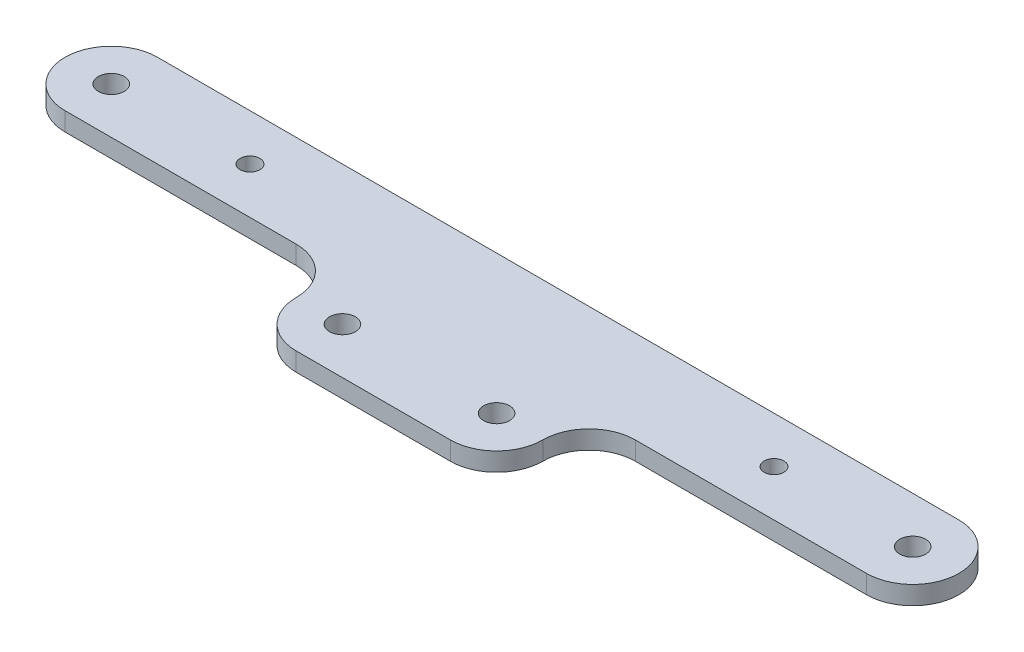
ISO-10303-21;
HEADER;
FILE_DESCRIPTION(('STEP AP214'),'2;1');
FILE_NAME('part.step','',(''),(''),'','','');
FILE_SCHEMA(('AUTOMOTIVE_DESIGN { 1 0 10303 214 1 1 1 1 }'));
ENDSEC;
DATA;
#1=APPLICATION_CONTEXT('core data for automotive mechanical design processes');
#2=APPLICATION_PROTOCOL_DEFINITION('international standard','automotive_design',2000,#1);
#3=PRODUCT_CONTEXT('',#1,'mechanical');
#4=PRODUCT('Part','Part','',(#3));
#5=PRODUCT_RELATED_PRODUCT_CATEGORY('part','',(#4));
#6=PRODUCT_DEFINITION_FORMATION('','',#4);
#7=PRODUCT_DEFINITION_CONTEXT('part definition',#1,'design');
#8=PRODUCT_DEFINITION('design','',#6,#7);
#9=PRODUCT_DEFINITION_SHAPE('','',#8);
#10=(LENGTH_UNIT() NAMED_UNIT(*) SI_UNIT(.MILLI.,.METRE.));
#11=(NAMED_UNIT(*) PLANE_ANGLE_UNIT() SI_UNIT($,.RADIAN.));
#12=(NAMED_UNIT(*) SI_UNIT($,.STERADIAN.) SOLID_ANGLE_UNIT());
#13=UNCERTAINTY_MEASURE_WITH_UNIT(LENGTH_MEASURE(1.E-05),#10,'distance_accuracy_value','');
#14=(GEOMETRIC_REPRESENTATION_CONTEXT(3) GLOBAL_UNCERTAINTY_ASSIGNED_CONTEXT((#13)) GLOBAL_UNIT_ASSIGNED_CONTEXT((#10,
#11,#12)) REPRESENTATION_CONTEXT('',''));
#15=CARTESIAN_POINT('',(0.,0.,0.));
#16=DIRECTION('',(0.,0.,1.));
#17=DIRECTION('',(1.,0.,0.));
#18=AXIS2_PLACEMENT_3D('',#15,#16,#17);
#19=CARTESIAN_POINT('',(-65.,3.,7.5));
#20=DIRECTION('',(0.,0.,-1.));
#21=DIRECTION('',(-1.,0.,0.));
#22=AXIS2_PLACEMENT_3D('',#19,#20,#21);
#23=PLANE('',#22);
#24=DIRECTION('',(1.,0.,0.));
#25=VECTOR('',#24,1.);
#26=CARTESIAN_POINT('',(-65.,0.,7.5));
#27=LINE('',#26,#25);
#28=CARTESIAN_POINT('',(-65.,0.,7.5));
#29=VERTEX_POINT('',#28);
#30=CARTESIAN_POINT('',(-27.5,0.,7.49999999999999));
#31=VERTEX_POINT('',#30);
#32=EDGE_CURVE('E234',#29,#31,#27,.T.);
#33=ORIENTED_EDGE('',*,*,#32,.T.);
#34=DIRECTION('',(0.,-1.,0.));
#35=VECTOR('',#34,1.);
#36=CARTESIAN_POINT('',(-27.5,3.,7.49999999999999));
#37=LINE('',#36,#35);
#38=CARTESIAN_POINT('',(-27.5,3.,7.49999999999999));
#39=VERTEX_POINT('',#38);
#40=EDGE_CURVE('E129',#31,#39,#37,.F.);
#41=ORIENTED_EDGE('',*,*,#40,.T.);
#42=DIRECTION('',(1.,0.,0.));
#43=VECTOR('',#42,1.);
#44=CARTESIAN_POINT('',(-65.,3.,7.5));
#45=LINE('',#44,#43);
#46=CARTESIAN_POINT('',(-65.,3.,7.5));
#47=VERTEX_POINT('',#46);
#48=EDGE_CURVE('E123',#47,#39,#45,.T.);
#49=ORIENTED_EDGE('',*,*,#48,.F.);
#50=DIRECTION('',(0.,-1.,0.));
#51=VECTOR('',#50,1.);
#52=CARTESIAN_POINT('',(-65.,3.,7.5));
#53=LINE('',#52,#51);
#54=EDGE_CURVE('E126',#47,#29,#53,.T.);
#55=ORIENTED_EDGE('',*,*,#54,.T.);
#56=EDGE_LOOP('',(#33,#41,#49,#55));
#57=FACE_BOUND('',#56,.T.);
#58=ADVANCED_FACE('F48',(#57),#23,.F.);
#59=CARTESIAN_POINT('',(27.5,3.,7.49999999999998));
#60=VERTEX_POINT('',#59);
#61=CARTESIAN_POINT('',(65.,3.,7.5));
#62=VERTEX_POINT('',#61);
#63=EDGE_CURVE('E133',#60,#62,#45,.T.);
#64=ORIENTED_EDGE('',*,*,#63,.F.);
#65=DIRECTION('',(0.,1.,0.));
#66=VECTOR('',#65,1.);
#67=CARTESIAN_POINT('',(27.5,0.,7.49999999999998));
#68=LINE('',#67,#66);
#69=CARTESIAN_POINT('',(27.5,0.,7.49999999999998));
#70=VERTEX_POINT('',#69);
#71=EDGE_CURVE('E150',#60,#70,#68,.F.);
#72=ORIENTED_EDGE('',*,*,#71,.T.);
#73=CARTESIAN_POINT('',(65.,0.,7.5));
#74=VERTEX_POINT('',#73);
#75=EDGE_CURVE('E233',#70,#74,#27,.T.);
#76=ORIENTED_EDGE('',*,*,#75,.T.);
#77=DIRECTION('',(0.,-1.,0.));
#78=VECTOR('',#77,1.);
#79=CARTESIAN_POINT('',(65.,3.,7.5));
#80=LINE('',#79,#78);
#81=EDGE_CURVE('E151',#62,#74,#80,.T.);
#82=ORIENTED_EDGE('',*,*,#81,.F.);
#83=EDGE_LOOP('',(#64,#72,#76,#82));
#84=FACE_BOUND('',#83,.T.);
#85=ADVANCED_FACE('F254',(#84),#23,.F.);
#86=CARTESIAN_POINT('',(-65.,3.,0.));
#87=DIRECTION('',(0.,1.,0.));
#88=DIRECTION('',(0.,0.,1.));
#89=AXIS2_PLACEMENT_3D('',#86,#87,#88);
#90=PLANE('',#89);
#91=CARTESIAN_POINT('',(-12.5,3.,15.));
#92=DIRECTION('',(0.,-1.,0.));
#93=DIRECTION('',(0.,0.,-1.));
#94=AXIS2_PLACEMENT_3D('',#91,#92,#93);
#95=CIRCLE('',#94,2.1);
#96=CARTESIAN_POINT('',(-12.5,3.,12.9));
#97=VERTEX_POINT('',#96);
#98=EDGE_CURVE('E206',#97,#97,#95,.T.);
#99=ORIENTED_EDGE('',*,*,#98,.T.);
#100=EDGE_LOOP('',(#99));
#101=FACE_BOUND('',#100,.T.);
#102=CARTESIAN_POINT('',(12.5,3.,15.));
#103=DIRECTION('',(0.,-1.,0.));
#104=DIRECTION('',(0.,0.,-1.));
#105=AXIS2_PLACEMENT_3D('',#102,#103,#104);
#106=CIRCLE('',#105,2.1);
#107=CARTESIAN_POINT('',(12.5,3.,12.9));
#108=VERTEX_POINT('',#107);
#109=EDGE_CURVE('E184',#108,#108,#106,.T.);
#110=ORIENTED_EDGE('',*,*,#109,.T.);
#111=EDGE_LOOP('',(#110));
#112=FACE_BOUND('',#111,.T.);
#113=CARTESIAN_POINT('',(65.,3.,0.));
#114=DIRECTION('',(0.,1.,0.));
#115=DIRECTION('',(0.,0.,1.));
#116=AXIS2_PLACEMENT_3D('',#113,#114,#115);
#117=CIRCLE('',#116,2.1);
#118=CARTESIAN_POINT('',(65.,3.,2.1));
#119=VERTEX_POINT('',#118);
#120=EDGE_CURVE('E212',#119,#119,#117,.T.);
#121=ORIENTED_EDGE('',*,*,#120,.F.);
#122=EDGE_LOOP('',(#121));
#123=FACE_BOUND('',#122,.T.);
#124=CARTESIAN_POINT('',(-42.5,3.,0.));
#125=DIRECTION('',(0.,1.,0.));
#126=DIRECTION('',(0.,0.,1.));
#127=AXIS2_PLACEMENT_3D('',#124,#125,#126);
#128=CIRCLE('',#127,1.6);
#129=CARTESIAN_POINT('',(-42.5,3.,1.6));
#130=VERTEX_POINT('',#129);
#131=EDGE_CURVE('E224',#130,#130,#128,.T.);
#132=ORIENTED_EDGE('',*,*,#131,.F.);
#133=EDGE_LOOP('',(#132));
#134=FACE_BOUND('',#133,.T.);
#135=DIRECTION('',(-1.,0.,0.));
#136=VECTOR('',#135,1.);
#137=CARTESIAN_POINT('',(-20.,3.,22.5));
#138=LINE('',#137,#136);
#139=CARTESIAN_POINT('',(12.5,3.,22.5));
#140=VERTEX_POINT('',#139);
#141=CARTESIAN_POINT('',(-12.5,3.,22.5));
#142=VERTEX_POINT('',#141);
#143=EDGE_CURVE('E194',#140,#142,#138,.T.);
#144=ORIENTED_EDGE('',*,*,#143,.F.);
#145=CARTESIAN_POINT('',(12.5,3.,15.));
#146=DIRECTION('',(0.,1.,0.));
#147=DIRECTION('',(0.,0.,1.));
#148=AXIS2_PLACEMENT_3D('',#145,#146,#147);
#149=CIRCLE('',#148,7.5);
#150=CARTESIAN_POINT('',(20.,3.,15.));
#151=VERTEX_POINT('',#150);
#152=EDGE_CURVE('E167',#140,#151,#149,.T.);
#153=ORIENTED_EDGE('',*,*,#152,.T.);
#154=CARTESIAN_POINT('',(27.5,3.,15.));
#155=DIRECTION('',(0.,1.,0.));
#156=DIRECTION('',(0.,0.,1.));
#157=AXIS2_PLACEMENT_3D('',#154,#155,#156);
#158=CIRCLE('',#157,7.5);
#159=EDGE_CURVE('E173',#151,#60,#158,.F.);
#160=ORIENTED_EDGE('',*,*,#159,.T.);
#161=ORIENTED_EDGE('',*,*,#63,.T.);
#162=CARTESIAN_POINT('',(65.,3.,0.));
#163=DIRECTION('',(0.,1.,0.));
#164=DIRECTION('',(0.,0.,1.));
#165=AXIS2_PLACEMENT_3D('',#162,#163,#164);
#166=CIRCLE('',#165,7.5);
#167=CARTESIAN_POINT('',(65.,3.,-7.50000000000002));
#168=VERTEX_POINT('',#167);
#169=EDGE_CURVE('E132',#62,#168,#166,.T.);
#170=ORIENTED_EDGE('',*,*,#169,.T.);
#171=DIRECTION('',(-1.,0.,0.));
#172=VECTOR('',#171,1.);
#173=CARTESIAN_POINT('',(-65.,3.,-7.5));
#174=LINE('',#173,#172);
#175=CARTESIAN_POINT('',(-65.,3.,-7.5));
#176=VERTEX_POINT('',#175);
#177=EDGE_CURVE('E141',#168,#176,#174,.T.);
#178=ORIENTED_EDGE('',*,*,#177,.T.);
#179=CARTESIAN_POINT('',(-65.,3.,0.));
#180=DIRECTION('',(0.,1.,0.));
#181=DIRECTION('',(0.,0.,1.));
#182=AXIS2_PLACEMENT_3D('',#179,#180,#181);
#183=CIRCLE('',#182,7.5);
#184=EDGE_CURVE('E136',#176,#47,#183,.T.);
#185=ORIENTED_EDGE('',*,*,#184,.T.);
#186=ORIENTED_EDGE('',*,*,#48,.T.);
#187=CARTESIAN_POINT('',(-27.5,3.,15.));
#188=DIRECTION('',(0.,1.,0.));
#189=DIRECTION('',(0.,0.,1.));
#190=AXIS2_PLACEMENT_3D('',#187,#188,#189);
#191=CIRCLE('',#190,7.5);
#192=CARTESIAN_POINT('',(-20.,3.,15.));
#193=VERTEX_POINT('',#192);
#194=EDGE_CURVE('E13',#39,#193,#191,.F.);
#195=ORIENTED_EDGE('',*,*,#194,.T.);
#196=CARTESIAN_POINT('',(-12.5,3.,15.));
#197=DIRECTION('',(0.,1.,0.));
#198=DIRECTION('',(0.,0.,1.));
#199=AXIS2_PLACEMENT_3D('',#196,#197,#198);
#200=CIRCLE('',#199,7.5);
#201=EDGE_CURVE('E165',#193,#142,#200,.T.);
#202=ORIENTED_EDGE('',*,*,#201,.T.);
#203=EDGE_LOOP('',(#144,#153,#160,#161,#170,#178,#185,#186,#195,#202));
#204=FACE_BOUND('',#203,.T.);
#205=CARTESIAN_POINT('',(-65.,3.,0.));
#206=DIRECTION('',(0.,1.,0.));
#207=DIRECTION('',(0.,0.,1.));
#208=AXIS2_PLACEMENT_3D('',#205,#206,#207);
#209=CIRCLE('',#208,2.1);
#210=CARTESIAN_POINT('',(-65.,3.,2.1));
#211=VERTEX_POINT('',#210);
#212=EDGE_CURVE('E218',#211,#211,#209,.T.);
#213=ORIENTED_EDGE('',*,*,#212,.F.);
#214=EDGE_LOOP('',(#213));
#215=FACE_BOUND('',#214,.T.);
#216=CARTESIAN_POINT('',(42.5,3.,0.));
#217=DIRECTION('',(0.,1.,0.));
#218=DIRECTION('',(0.,0.,1.));
#219=AXIS2_PLACEMENT_3D('',#216,#217,#218);
#220=CIRCLE('',#219,1.6);
#221=CARTESIAN_POINT('',(42.5,3.,1.59999999999998));
#222=VERTEX_POINT('',#221);
#223=EDGE_CURVE('E204',#222,#222,#220,.T.);
#224=ORIENTED_EDGE('',*,*,#223,.F.);
#225=EDGE_LOOP('',(#224));
#226=FACE_BOUND('',#225,.T.);
#227=ADVANCED_FACE('F138',(#101,#112,#123,#134,#204,#215,#226),#90,.T.);
#228=CARTESIAN_POINT('',(-65.,0.,0.));
#229=DIRECTION('',(0.,1.,0.));
#230=DIRECTION('',(0.,0.,1.));
#231=AXIS2_PLACEMENT_3D('',#228,#229,#230);
#232=PLANE('',#231);
#233=CARTESIAN_POINT('',(-12.5,0.,15.));
#234=DIRECTION('',(0.,-1.,0.));
#235=DIRECTION('',(0.,0.,-1.));
#236=AXIS2_PLACEMENT_3D('',#233,#234,#235);
#237=CIRCLE('',#236,2.1);
#238=CARTESIAN_POINT('',(-12.5,0.,12.9));
#239=VERTEX_POINT('',#238);
#240=EDGE_CURVE('E327',#239,#239,#237,.T.);
#241=ORIENTED_EDGE('',*,*,#240,.F.);
#242=EDGE_LOOP('',(#241));
#243=FACE_BOUND('',#242,.T.);
#244=CARTESIAN_POINT('',(12.5,0.,15.));
#245=DIRECTION('',(0.,-1.,0.));
#246=DIRECTION('',(0.,0.,-1.));
#247=AXIS2_PLACEMENT_3D('',#244,#245,#246);
#248=CIRCLE('',#247,2.1);
#249=CARTESIAN_POINT('',(12.5,0.,12.9));
#250=VERTEX_POINT('',#249);
#251=EDGE_CURVE('E179',#250,#250,#248,.T.);
#252=ORIENTED_EDGE('',*,*,#251,.F.);
#253=EDGE_LOOP('',(#252));
#254=FACE_BOUND('',#253,.T.);
#255=ORIENTED_EDGE('',*,*,#75,.F.);
#256=CARTESIAN_POINT('',(27.5,0.,15.));
#257=DIRECTION('',(0.,1.,0.));
#258=DIRECTION('',(0.,0.,1.));
#259=AXIS2_PLACEMENT_3D('',#256,#257,#258);
#260=CIRCLE('',#259,7.5);
#261=CARTESIAN_POINT('',(20.,0.,15.));
#262=VERTEX_POINT('',#261);
#263=EDGE_CURVE('E175',#70,#262,#260,.T.);
#264=ORIENTED_EDGE('',*,*,#263,.T.);
#265=CARTESIAN_POINT('',(12.5,0.,15.));
#266=DIRECTION('',(0.,1.,0.));
#267=DIRECTION('',(0.,0.,1.));
#268=AXIS2_PLACEMENT_3D('',#265,#266,#267);
#269=CIRCLE('',#268,7.5);
#270=CARTESIAN_POINT('',(12.5,0.,22.5));
#271=VERTEX_POINT('',#270);
#272=EDGE_CURVE('E170',#262,#271,#269,.F.);
#273=ORIENTED_EDGE('',*,*,#272,.T.);
#274=DIRECTION('',(1.,0.,0.));
#275=VECTOR('',#274,1.);
#276=CARTESIAN_POINT('',(-20.,0.,22.5));
#277=LINE('',#276,#275);
#278=CARTESIAN_POINT('',(-12.5,0.,22.5));
#279=VERTEX_POINT('',#278);
#280=EDGE_CURVE('E201',#279,#271,#277,.T.);
#281=ORIENTED_EDGE('',*,*,#280,.F.);
#282=CARTESIAN_POINT('',(-12.5,0.,15.));
#283=DIRECTION('',(0.,1.,0.));
#284=DIRECTION('',(0.,0.,1.));
#285=AXIS2_PLACEMENT_3D('',#282,#283,#284);
#286=CIRCLE('',#285,7.5);
#287=CARTESIAN_POINT('',(-20.,0.,15.));
#288=VERTEX_POINT('',#287);
#289=EDGE_CURVE('E69',#279,#288,#286,.F.);
#290=ORIENTED_EDGE('',*,*,#289,.T.);
#291=CARTESIAN_POINT('',(-27.5,0.,15.));
#292=DIRECTION('',(0.,1.,0.));
#293=DIRECTION('',(0.,0.,1.));
#294=AXIS2_PLACEMENT_3D('',#291,#292,#293);
#295=CIRCLE('',#294,7.5);
#296=EDGE_CURVE('E57',#288,#31,#295,.T.);
#297=ORIENTED_EDGE('',*,*,#296,.T.);
#298=ORIENTED_EDGE('',*,*,#32,.F.);
#299=CARTESIAN_POINT('',(-65.,0.,0.));
#300=DIRECTION('',(0.,1.,0.));
#301=DIRECTION('',(0.,0.,1.));
#302=AXIS2_PLACEMENT_3D('',#299,#300,#301);
#303=CIRCLE('',#302,7.5);
#304=CARTESIAN_POINT('',(-65.,0.,-7.5));
#305=VERTEX_POINT('',#304);
#306=EDGE_CURVE('E149',#305,#29,#303,.T.);
#307=ORIENTED_EDGE('',*,*,#306,.F.);
#308=DIRECTION('',(-1.,0.,0.));
#309=VECTOR('',#308,1.);
#310=CARTESIAN_POINT('',(-65.,0.,-7.5));
#311=LINE('',#310,#309);
#312=CARTESIAN_POINT('',(65.,0.,-7.50000000000002));
#313=VERTEX_POINT('',#312);
#314=EDGE_CURVE('E145',#313,#305,#311,.T.);
#315=ORIENTED_EDGE('',*,*,#314,.F.);
#316=CARTESIAN_POINT('',(65.,0.,0.));
#317=DIRECTION('',(0.,1.,0.));
#318=DIRECTION('',(0.,0.,1.));
#319=AXIS2_PLACEMENT_3D('',#316,#317,#318);
#320=CIRCLE('',#319,7.5);
#321=EDGE_CURVE('E236',#74,#313,#320,.T.);
#322=ORIENTED_EDGE('',*,*,#321,.F.);
#323=EDGE_LOOP('',(#255,#264,#273,#281,#290,#297,#298,#307,#315,#322));
#324=FACE_BOUND('',#323,.T.);
#325=CARTESIAN_POINT('',(-42.5,0.,0.));
#326=DIRECTION('',(0.,1.,0.));
#327=DIRECTION('',(0.,0.,1.));
#328=AXIS2_PLACEMENT_3D('',#325,#326,#327);
#329=CIRCLE('',#328,1.6);
#330=CARTESIAN_POINT('',(-42.5,0.,1.6));
#331=VERTEX_POINT('',#330);
#332=EDGE_CURVE('E221',#331,#331,#329,.T.);
#333=ORIENTED_EDGE('',*,*,#332,.T.);
#334=EDGE_LOOP('',(#333));
#335=FACE_BOUND('',#334,.T.);
#336=CARTESIAN_POINT('',(-65.,0.,0.));
#337=DIRECTION('',(0.,1.,0.));
#338=DIRECTION('',(0.,0.,1.));
#339=AXIS2_PLACEMENT_3D('',#336,#337,#338);
#340=CIRCLE('',#339,2.1);
#341=CARTESIAN_POINT('',(-65.,0.,2.1));
#342=VERTEX_POINT('',#341);
#343=EDGE_CURVE('E215',#342,#342,#340,.T.);
#344=ORIENTED_EDGE('',*,*,#343,.T.);
#345=EDGE_LOOP('',(#344));
#346=FACE_BOUND('',#345,.T.);
#347=CARTESIAN_POINT('',(65.,0.,0.));
#348=DIRECTION('',(0.,1.,0.));
#349=DIRECTION('',(0.,0.,1.));
#350=AXIS2_PLACEMENT_3D('',#347,#348,#349);
#351=CIRCLE('',#350,2.1);
#352=CARTESIAN_POINT('',(65.,0.,2.1));
#353=VERTEX_POINT('',#352);
#354=EDGE_CURVE('E210',#353,#353,#351,.T.);
#355=ORIENTED_EDGE('',*,*,#354,.T.);
#356=EDGE_LOOP('',(#355));
#357=FACE_BOUND('',#356,.T.);
#358=CARTESIAN_POINT('',(42.5,0.,0.));
#359=DIRECTION('',(0.,1.,0.));
#360=DIRECTION('',(0.,0.,1.));
#361=AXIS2_PLACEMENT_3D('',#358,#359,#360);
#362=CIRCLE('',#361,1.6);
#363=CARTESIAN_POINT('',(42.5,0.,1.59999999999998));
#364=VERTEX_POINT('',#363);
#365=EDGE_CURVE('E200',#364,#364,#362,.T.);
#366=ORIENTED_EDGE('',*,*,#365,.T.);
#367=EDGE_LOOP('',(#366));
#368=FACE_BOUND('',#367,.T.);
#369=ADVANCED_FACE('F248',(#243,#254,#324,#335,#346,#357,#368),#232,.F.);
#370=CARTESIAN_POINT('',(-65.,3.,0.));
#371=DIRECTION('',(0.,-1.,0.));
#372=DIRECTION('',(0.,0.,-1.));
#373=AXIS2_PLACEMENT_3D('',#370,#371,#372);
#374=CYLINDRICAL_SURFACE('',#373,7.5);
#375=ORIENTED_EDGE('',*,*,#306,.T.);
#376=ORIENTED_EDGE('',*,*,#54,.F.);
#377=ORIENTED_EDGE('',*,*,#184,.F.);
#378=DIRECTION('',(0.,-1.,0.));
#379=VECTOR('',#378,1.);
#380=CARTESIAN_POINT('',(-65.,3.,-7.5));
#381=LINE('',#380,#379);
#382=EDGE_CURVE('E231',#176,#305,#381,.T.);
#383=ORIENTED_EDGE('',*,*,#382,.T.);
#384=EDGE_LOOP('',(#375,#376,#377,#383));
#385=FACE_BOUND('',#384,.T.);
#386=ADVANCED_FACE('F147',(#385),#374,.T.);
#387=CARTESIAN_POINT('',(65.,3.,0.));
#388=DIRECTION('',(0.,-1.,0.));
#389=DIRECTION('',(0.,0.,-1.));
#390=AXIS2_PLACEMENT_3D('',#387,#388,#389);
#391=CYLINDRICAL_SURFACE('',#390,7.5);
#392=ORIENTED_EDGE('',*,*,#321,.T.);
#393=DIRECTION('',(0.,-1.,0.));
#394=VECTOR('',#393,1.);
#395=CARTESIAN_POINT('',(65.,3.,-7.50000000000002));
#396=LINE('',#395,#394);
#397=EDGE_CURVE('E157',#168,#313,#396,.T.);
#398=ORIENTED_EDGE('',*,*,#397,.F.);
#399=ORIENTED_EDGE('',*,*,#169,.F.);
#400=ORIENTED_EDGE('',*,*,#81,.T.);
#401=EDGE_LOOP('',(#392,#398,#399,#400));
#402=FACE_BOUND('',#401,.T.);
#403=ADVANCED_FACE('F250',(#402),#391,.T.);
#404=CARTESIAN_POINT('',(-65.,3.,-7.5));
#405=DIRECTION('',(0.,0.,1.));
#406=DIRECTION('',(1.,0.,0.));
#407=AXIS2_PLACEMENT_3D('',#404,#405,#406);
#408=PLANE('',#407);
#409=ORIENTED_EDGE('',*,*,#314,.T.);
#410=ORIENTED_EDGE('',*,*,#382,.F.);
#411=ORIENTED_EDGE('',*,*,#177,.F.);
#412=ORIENTED_EDGE('',*,*,#397,.T.);
#413=EDGE_LOOP('',(#409,#410,#411,#412));
#414=FACE_BOUND('',#413,.T.);
#415=ADVANCED_FACE('F243',(#414),#408,.F.);
#416=CARTESIAN_POINT('',(-42.5,3.,0.));
#417=DIRECTION('',(0.,-1.,0.));
#418=DIRECTION('',(0.,0.,-1.));
#419=AXIS2_PLACEMENT_3D('',#416,#417,#418);
#420=CYLINDRICAL_SURFACE('',#419,1.6);
#421=ORIENTED_EDGE('',*,*,#131,.T.);
#422=EDGE_LOOP('',(#421));
#423=FACE_BOUND('',#422,.T.);
#424=ORIENTED_EDGE('',*,*,#332,.F.);
#425=EDGE_LOOP('',(#424));
#426=FACE_BOUND('',#425,.T.);
#427=ADVANCED_FACE('F295',(#423,#426),#420,.F.);
#428=CARTESIAN_POINT('',(-65.,3.,0.));
#429=DIRECTION('',(0.,-1.,0.));
#430=DIRECTION('',(0.,0.,-1.));
#431=AXIS2_PLACEMENT_3D('',#428,#429,#430);
#432=CYLINDRICAL_SURFACE('',#431,2.1);
#433=ORIENTED_EDGE('',*,*,#212,.T.);
#434=EDGE_LOOP('',(#433));
#435=FACE_BOUND('',#434,.T.);
#436=ORIENTED_EDGE('',*,*,#343,.F.);
#437=EDGE_LOOP('',(#436));
#438=FACE_BOUND('',#437,.T.);
#439=ADVANCED_FACE('F299',(#435,#438),#432,.F.);
#440=CARTESIAN_POINT('',(65.,3.,0.));
#441=DIRECTION('',(0.,-1.,0.));
#442=DIRECTION('',(0.,0.,-1.));
#443=AXIS2_PLACEMENT_3D('',#440,#441,#442);
#444=CYLINDRICAL_SURFACE('',#443,2.1);
#445=ORIENTED_EDGE('',*,*,#120,.T.);
#446=EDGE_LOOP('',(#445));
#447=FACE_BOUND('',#446,.T.);
#448=ORIENTED_EDGE('',*,*,#354,.F.);
#449=EDGE_LOOP('',(#448));
#450=FACE_BOUND('',#449,.T.);
#451=ADVANCED_FACE('F304',(#447,#450),#444,.F.);
#452=CARTESIAN_POINT('',(42.5,3.,0.));
#453=DIRECTION('',(0.,-1.,0.));
#454=DIRECTION('',(0.,0.,-1.));
#455=AXIS2_PLACEMENT_3D('',#452,#453,#454);
#456=CYLINDRICAL_SURFACE('',#455,1.6);
#457=ORIENTED_EDGE('',*,*,#223,.T.);
#458=EDGE_LOOP('',(#457));
#459=FACE_BOUND('',#458,.T.);
#460=ORIENTED_EDGE('',*,*,#365,.F.);
#461=EDGE_LOOP('',(#460));
#462=FACE_BOUND('',#461,.T.);
#463=ADVANCED_FACE('F311',(#459,#462),#456,.F.);
#464=CARTESIAN_POINT('',(0.,0.,22.5));
#465=DIRECTION('',(0.,0.,-1.));
#466=DIRECTION('',(-1.,0.,0.));
#467=AXIS2_PLACEMENT_3D('',#464,#465,#466);
#468=PLANE('',#467);
#469=ORIENTED_EDGE('',*,*,#280,.T.);
#470=DIRECTION('',(0.,1.,0.));
#471=VECTOR('',#470,1.);
#472=CARTESIAN_POINT('',(12.5,0.,22.5));
#473=LINE('',#472,#471);
#474=EDGE_CURVE('E163',#271,#140,#473,.T.);
#475=ORIENTED_EDGE('',*,*,#474,.T.);
#476=ORIENTED_EDGE('',*,*,#143,.T.);
#477=DIRECTION('',(0.,-1.,0.));
#478=VECTOR('',#477,1.);
#479=CARTESIAN_POINT('',(-12.5,0.,22.5));
#480=LINE('',#479,#478);
#481=EDGE_CURVE('E154',#142,#279,#480,.T.);
#482=ORIENTED_EDGE('',*,*,#481,.T.);
#483=EDGE_LOOP('',(#469,#475,#476,#482));
#484=FACE_BOUND('',#483,.T.);
#485=ADVANCED_FACE('F198',(#484),#468,.F.);
#486=CARTESIAN_POINT('',(12.5,3.,15.));
#487=DIRECTION('',(0.,-1.,0.));
#488=DIRECTION('',(0.,0.,-1.));
#489=AXIS2_PLACEMENT_3D('',#486,#487,#488);
#490=CYLINDRICAL_SURFACE('',#489,2.1);
#491=ORIENTED_EDGE('',*,*,#109,.F.);
#492=EDGE_LOOP('',(#491));
#493=FACE_BOUND('',#492,.T.);
#494=ORIENTED_EDGE('',*,*,#251,.T.);
#495=EDGE_LOOP('',(#494));
#496=FACE_BOUND('',#495,.T.);
#497=ADVANCED_FACE('F268',(#493,#496),#490,.F.);
#498=CARTESIAN_POINT('',(-12.5,3.,15.));
#499=DIRECTION('',(0.,-1.,0.));
#500=DIRECTION('',(0.,0.,-1.));
#501=AXIS2_PLACEMENT_3D('',#498,#499,#500);
#502=CYLINDRICAL_SURFACE('',#501,2.1);
#503=ORIENTED_EDGE('',*,*,#98,.F.);
#504=EDGE_LOOP('',(#503));
#505=FACE_BOUND('',#504,.T.);
#506=ORIENTED_EDGE('',*,*,#240,.T.);
#507=EDGE_LOOP('',(#506));
#508=FACE_BOUND('',#507,.T.);
#509=ADVANCED_FACE('F261',(#505,#508),#502,.F.);
#510=CARTESIAN_POINT('',(12.5,0.,15.));
#511=DIRECTION('',(0.,1.,0.));
#512=DIRECTION('',(0.,0.,1.));
#513=AXIS2_PLACEMENT_3D('',#510,#511,#512);
#514=CYLINDRICAL_SURFACE('',#513,7.5);
#515=ORIENTED_EDGE('',*,*,#474,.F.);
#516=ORIENTED_EDGE('',*,*,#272,.F.);
#517=DIRECTION('',(0.,1.,0.));
#518=VECTOR('',#517,1.);
#519=CARTESIAN_POINT('',(20.,0.,15.));
#520=LINE('',#519,#518);
#521=EDGE_CURVE('E177',#151,#262,#520,.F.);
#522=ORIENTED_EDGE('',*,*,#521,.F.);
#523=ORIENTED_EDGE('',*,*,#152,.F.);
#524=EDGE_LOOP('',(#515,#516,#522,#523));
#525=FACE_BOUND('',#524,.T.);
#526=ADVANCED_FACE('F259',(#525),#514,.T.);
#527=CARTESIAN_POINT('',(27.5,0.,15.));
#528=DIRECTION('',(0.,-1.,0.));
#529=DIRECTION('',(0.,0.,-1.));
#530=AXIS2_PLACEMENT_3D('',#527,#528,#529);
#531=CYLINDRICAL_SURFACE('',#530,7.5);
#532=ORIENTED_EDGE('',*,*,#263,.F.);
#533=ORIENTED_EDGE('',*,*,#71,.F.);
#534=ORIENTED_EDGE('',*,*,#159,.F.);
#535=ORIENTED_EDGE('',*,*,#521,.T.);
#536=EDGE_LOOP('',(#532,#533,#534,#535));
#537=FACE_BOUND('',#536,.T.);
#538=ADVANCED_FACE('F256',(#537),#531,.F.);
#539=CARTESIAN_POINT('',(-27.5,0.,15.));
#540=DIRECTION('',(0.,1.,0.));
#541=DIRECTION('',(0.,0.,1.));
#542=AXIS2_PLACEMENT_3D('',#539,#540,#541);
#543=CYLINDRICAL_SURFACE('',#542,7.5);
#544=DIRECTION('',(0.,-1.,0.));
#545=VECTOR('',#544,1.);
#546=CARTESIAN_POINT('',(-20.,0.,15.));
#547=LINE('',#546,#545);
#548=EDGE_CURVE('E52',#193,#288,#547,.T.);
#549=ORIENTED_EDGE('',*,*,#548,.F.);
#550=ORIENTED_EDGE('',*,*,#194,.F.);
#551=ORIENTED_EDGE('',*,*,#40,.F.);
#552=ORIENTED_EDGE('',*,*,#296,.F.);
#553=EDGE_LOOP('',(#549,#550,#551,#552));
#554=FACE_BOUND('',#553,.T.);
#555=ADVANCED_FACE('F50',(#554),#543,.F.);
#556=CARTESIAN_POINT('',(-12.5,0.,15.));
#557=DIRECTION('',(0.,-1.,0.));
#558=DIRECTION('',(0.,0.,-1.));
#559=AXIS2_PLACEMENT_3D('',#556,#557,#558);
#560=CYLINDRICAL_SURFACE('',#559,7.5);
#561=ORIENTED_EDGE('',*,*,#201,.F.);
#562=ORIENTED_EDGE('',*,*,#548,.T.);
#563=ORIENTED_EDGE('',*,*,#289,.F.);
#564=ORIENTED_EDGE('',*,*,#481,.F.);
#565=EDGE_LOOP('',(#561,#562,#563,#564));
#566=FACE_BOUND('',#565,.T.);
#567=ADVANCED_FACE('F190',(#566),#560,.T.);
#568=CLOSED_SHELL('',(#58,#85,#227,#369,#386,#403,#415,#427,#439,#451,#463,#485,#497,#509,#526,
#538,#555,#567));
#569=MANIFOLD_SOLID_BREP('B2',#568);
#570=ADVANCED_BREP_SHAPE_REPRESENTATION('',(#18,#569),#14);
#571=SHAPE_DEFINITION_REPRESENTATION(#9,#570);
ENDSEC;
END-ISO-10303-21;
